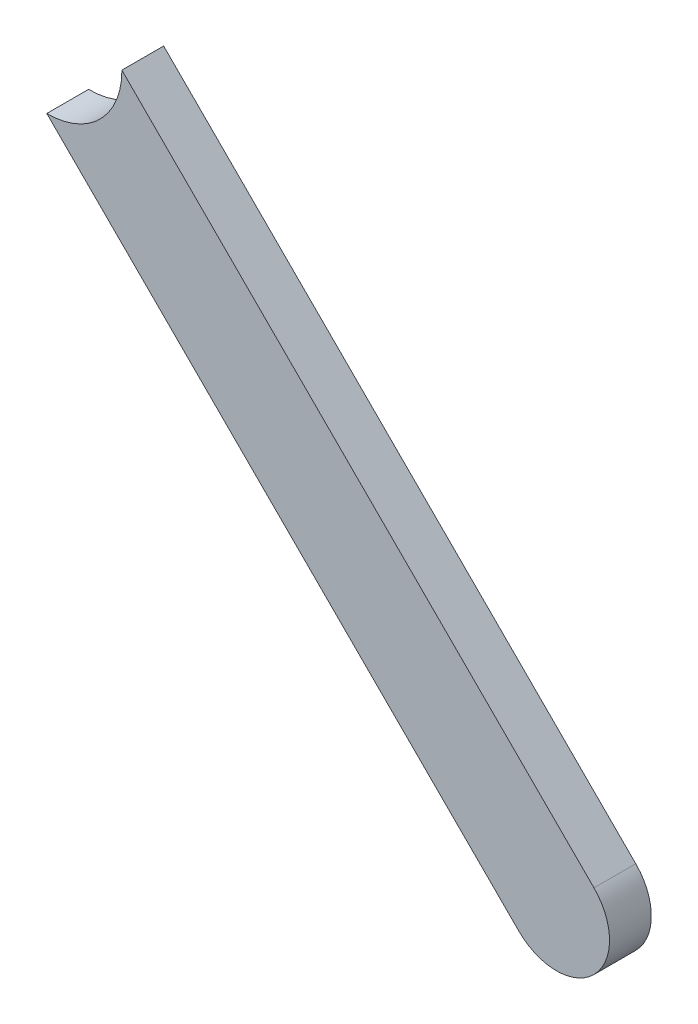
ISO-10303-21;
HEADER;
FILE_DESCRIPTION(('STEP AP214'),'2;1');
FILE_NAME('part.step','',(''),(''),'','','');
FILE_SCHEMA(('AUTOMOTIVE_DESIGN { 1 0 10303 214 1 1 1 1 }'));
ENDSEC;
DATA;
#1=APPLICATION_CONTEXT('core data for automotive mechanical design processes');
#2=APPLICATION_PROTOCOL_DEFINITION('international standard','automotive_design',2000,#1);
#3=PRODUCT_CONTEXT('',#1,'mechanical');
#4=PRODUCT('Part','Part','',(#3));
#5=PRODUCT_RELATED_PRODUCT_CATEGORY('part','',(#4));
#6=PRODUCT_DEFINITION_FORMATION('','',#4);
#7=PRODUCT_DEFINITION_CONTEXT('part definition',#1,'design');
#8=PRODUCT_DEFINITION('design','',#6,#7);
#9=PRODUCT_DEFINITION_SHAPE('','',#8);
#10=(LENGTH_UNIT() NAMED_UNIT(*) SI_UNIT(.MILLI.,.METRE.));
#11=(NAMED_UNIT(*) PLANE_ANGLE_UNIT() SI_UNIT($,.RADIAN.));
#12=(NAMED_UNIT(*) SI_UNIT($,.STERADIAN.) SOLID_ANGLE_UNIT());
#13=UNCERTAINTY_MEASURE_WITH_UNIT(LENGTH_MEASURE(1.E-05),#10,'distance_accuracy_value','');
#14=(GEOMETRIC_REPRESENTATION_CONTEXT(3) GLOBAL_UNCERTAINTY_ASSIGNED_CONTEXT((#13)) GLOBAL_UNIT_ASSIGNED_CONTEXT((#10,
#11,#12)) REPRESENTATION_CONTEXT('',''));
#15=CARTESIAN_POINT('',(0.,0.,0.));
#16=DIRECTION('',(0.,0.,1.));
#17=DIRECTION('',(1.,0.,0.));
#18=AXIS2_PLACEMENT_3D('',#15,#16,#17);
#19=CARTESIAN_POINT('',(124.075372153798,116.103418506202,0.));
#20=DIRECTION('',(0.707106781186547,0.707106781186548,0.));
#21=DIRECTION('',(0.707106781186548,-0.707106781186547,0.));
#22=AXIS2_PLACEMENT_3D('',#19,#20,#21);
#23=PLANE('',#22);
#24=DIRECTION('',(0.707106781186548,-0.707106781186547,0.));
#25=VECTOR('',#24,1.);
#26=CARTESIAN_POINT('',(118.1843966,121.99439406,0.1999996));
#27=LINE('',#26,#25);
#28=CARTESIAN_POINT('',(124.075372153798,116.103418506202,0.1999996));
#29=VERTEX_POINT('',#28);
#30=CARTESIAN_POINT('',(126.3344692,113.84432146,0.1999996));
#31=VERTEX_POINT('',#30);
#32=EDGE_CURVE('E11',#29,#31,#27,.T.);
#33=ORIENTED_EDGE('',*,*,#32,.F.);
#34=DIRECTION('',(0.,0.,1.));
#35=VECTOR('',#34,1.);
#36=CARTESIAN_POINT('',(124.075372153798,116.103418506202,0.));
#37=LINE('',#36,#35);
#38=CARTESIAN_POINT('',(124.075372153798,116.103418506202,0.));
#39=VERTEX_POINT('',#38);
#40=EDGE_CURVE('E24',#39,#29,#37,.T.);
#41=ORIENTED_EDGE('',*,*,#40,.F.);
#42=DIRECTION('',(0.707106781186548,-0.707106781186547,0.));
#43=VECTOR('',#42,1.);
#44=CARTESIAN_POINT('',(118.1843966,121.99439406,0.));
#45=LINE('',#44,#43);
#46=CARTESIAN_POINT('',(126.3344692,113.84432146,0.));
#47=VERTEX_POINT('',#46);
#48=EDGE_CURVE('E82',#39,#47,#45,.T.);
#49=ORIENTED_EDGE('',*,*,#48,.T.);
#50=DIRECTION('',(0.,0.,1.));
#51=VECTOR('',#50,1.);
#52=CARTESIAN_POINT('',(126.3344692,113.84432146,0.));
#53=LINE('',#52,#51);
#54=EDGE_CURVE('E37',#47,#31,#53,.T.);
#55=ORIENTED_EDGE('',*,*,#54,.T.);
#56=EDGE_LOOP('',(#33,#41,#49,#55));
#57=FACE_BOUND('',#56,.T.);
#58=ADVANCED_FACE('F17',(#57),#23,.F.);
#59=CARTESIAN_POINT('',(126.51407514,114.02392613,0.));
#60=DIRECTION('',(0.,0.,-1.));
#61=DIRECTION('',(-0.707109281179556,-0.7071042811847,0.));
#62=AXIS2_PLACEMENT_3D('',#59,#60,#61);
#63=CYLINDRICAL_SURFACE('',#62,0.254000258206741);
#64=CARTESIAN_POINT('',(126.51407514,114.02392613,0.1999996));
#65=DIRECTION('',(0.,0.,1.));
#66=DIRECTION('',(-0.707109281179556,-0.7071042811847,0.));
#67=AXIS2_PLACEMENT_3D('',#64,#65,#66);
#68=CIRCLE('',#67,0.254000258206741);
#69=CARTESIAN_POINT('',(126.69368108,114.2035308,0.1999996));
#70=VERTEX_POINT('',#69);
#71=EDGE_CURVE('E97',#31,#70,#68,.T.);
#72=ORIENTED_EDGE('',*,*,#71,.F.);
#73=ORIENTED_EDGE('',*,*,#54,.F.);
#74=CARTESIAN_POINT('',(126.51407514,114.02392613,0.));
#75=DIRECTION('',(0.,0.,1.));
#76=DIRECTION('',(-0.707109281179556,-0.7071042811847,0.));
#77=AXIS2_PLACEMENT_3D('',#74,#75,#76);
#78=CIRCLE('',#77,0.254000258206741);
#79=CARTESIAN_POINT('',(126.69368108,114.2035308,0.));
#80=VERTEX_POINT('',#79);
#81=EDGE_CURVE('E94',#47,#80,#78,.T.);
#82=ORIENTED_EDGE('',*,*,#81,.T.);
#83=DIRECTION('',(0.,0.,1.));
#84=VECTOR('',#83,1.);
#85=CARTESIAN_POINT('',(126.69368108,114.2035308,0.));
#86=LINE('',#85,#84);
#87=EDGE_CURVE('E92',#80,#70,#86,.T.);
#88=ORIENTED_EDGE('',*,*,#87,.T.);
#89=EDGE_LOOP('',(#72,#73,#82,#88));
#90=FACE_BOUND('',#89,.T.);
#91=ADVANCED_FACE('F103',(#90),#63,.T.);
#92=CARTESIAN_POINT('',(126.69368108,114.2035308,0.));
#93=DIRECTION('',(-0.707106781186548,-0.707106781186548,0.));
#94=DIRECTION('',(-0.707106781186548,0.707106781186548,0.));
#95=AXIS2_PLACEMENT_3D('',#92,#93,#94);
#96=PLANE('',#95);
#97=DIRECTION('',(-0.707106781186548,0.707106781186548,0.));
#98=VECTOR('',#97,1.);
#99=CARTESIAN_POINT('',(126.69368108,114.2035308,0.1999996));
#100=LINE('',#99,#98);
#101=CARTESIAN_POINT('',(124.434581467607,116.462630412393,0.1999996));
#102=VERTEX_POINT('',#101);
#103=EDGE_CURVE('E89',#70,#102,#100,.T.);
#104=ORIENTED_EDGE('',*,*,#103,.F.);
#105=ORIENTED_EDGE('',*,*,#87,.F.);
#106=DIRECTION('',(-0.707106781186548,0.707106781186548,0.));
#107=VECTOR('',#106,1.);
#108=CARTESIAN_POINT('',(126.69368108,114.2035308,0.));
#109=LINE('',#108,#107);
#110=CARTESIAN_POINT('',(124.434581467607,116.462630412393,0.));
#111=VERTEX_POINT('',#110);
#112=EDGE_CURVE('E87',#80,#111,#109,.T.);
#113=ORIENTED_EDGE('',*,*,#112,.T.);
#114=DIRECTION('',(0.,0.,1.));
#115=VECTOR('',#114,1.);
#116=CARTESIAN_POINT('',(124.434581467607,116.462630412393,0.));
#117=LINE('',#116,#115);
#118=EDGE_CURVE('E69',#111,#102,#117,.T.);
#119=ORIENTED_EDGE('',*,*,#118,.T.);
#120=EDGE_LOOP('',(#104,#105,#113,#119));
#121=FACE_BOUND('',#120,.T.);
#122=ADVANCED_FACE('F108',(#121),#96,.F.);
#123=CARTESIAN_POINT('',(124.079,116.459,0.));
#124=DIRECTION('',(0.,0.,-1.));
#125=DIRECTION('',(1.,0.,0.));
#126=AXIS2_PLACEMENT_3D('',#123,#124,#125);
#127=CYLINDRICAL_SURFACE('',#126,0.3556);
#128=DIRECTION('',(0.,0.,1.));
#129=VECTOR('',#128,1.);
#130=CARTESIAN_POINT('',(124.4346,116.459,0.));
#131=LINE('',#130,#129);
#132=CARTESIAN_POINT('',(124.4346,116.459,0.));
#133=VERTEX_POINT('',#132);
#134=CARTESIAN_POINT('',(124.4346,116.459,0.1999996));
#135=VERTEX_POINT('',#134);
#136=EDGE_CURVE('E59',#133,#135,#131,.T.);
#137=ORIENTED_EDGE('',*,*,#136,.T.);
#138=CARTESIAN_POINT('',(124.079,116.459,0.1999996));
#139=DIRECTION('',(0.,0.,1.));
#140=DIRECTION('',(1.,0.,0.));
#141=AXIS2_PLACEMENT_3D('',#138,#139,#140);
#142=CIRCLE('',#141,0.3556);
#143=EDGE_CURVE('E70',#135,#102,#142,.T.);
#144=ORIENTED_EDGE('',*,*,#143,.T.);
#145=ORIENTED_EDGE('',*,*,#118,.F.);
#146=CARTESIAN_POINT('',(124.079,116.459,0.));
#147=DIRECTION('',(0.,0.,1.));
#148=DIRECTION('',(1.,0.,0.));
#149=AXIS2_PLACEMENT_3D('',#146,#147,#148);
#150=CIRCLE('',#149,0.3556);
#151=EDGE_CURVE('E73',#133,#111,#150,.T.);
#152=ORIENTED_EDGE('',*,*,#151,.F.);
#153=EDGE_LOOP('',(#137,#144,#145,#152));
#154=FACE_BOUND('',#153,.T.);
#155=ADVANCED_FACE('F74',(#154),#127,.F.);
#156=CARTESIAN_POINT('',(124.079,116.459,0.));
#157=DIRECTION('',(0.,0.,-1.));
#158=DIRECTION('',(1.,0.,0.));
#159=AXIS2_PLACEMENT_3D('',#156,#157,#158);
#160=CYLINDRICAL_SURFACE('',#159,0.3556);
#161=ORIENTED_EDGE('',*,*,#40,.T.);
#162=CARTESIAN_POINT('',(124.079,116.459,0.1999996));
#163=DIRECTION('',(0.,0.,1.));
#164=DIRECTION('',(1.,0.,0.));
#165=AXIS2_PLACEMENT_3D('',#162,#163,#164);
#166=CIRCLE('',#165,0.3556);
#167=EDGE_CURVE('E65',#29,#135,#166,.T.);
#168=ORIENTED_EDGE('',*,*,#167,.T.);
#169=ORIENTED_EDGE('',*,*,#136,.F.);
#170=EDGE_CURVE('E63',#39,#133,#150,.T.);
#171=ORIENTED_EDGE('',*,*,#170,.F.);
#172=EDGE_LOOP('',(#161,#168,#169,#171));
#173=FACE_BOUND('',#172,.T.);
#174=ADVANCED_FACE('F61',(#173),#160,.F.);
#175=CARTESIAN_POINT('',(118.1843966,121.99439406,0.));
#176=DIRECTION('',(0.,0.,-1.));
#177=DIRECTION('',(-1.,0.,0.));
#178=AXIS2_PLACEMENT_3D('',#175,#176,#177);
#179=PLANE('',#178);
#180=ORIENTED_EDGE('',*,*,#48,.F.);
#181=ORIENTED_EDGE('',*,*,#170,.T.);
#182=ORIENTED_EDGE('',*,*,#151,.T.);
#183=ORIENTED_EDGE('',*,*,#112,.F.);
#184=ORIENTED_EDGE('',*,*,#81,.F.);
#185=EDGE_LOOP('',(#180,#181,#182,#183,#184));
#186=FACE_BOUND('',#185,.T.);
#187=ADVANCED_FACE('F80',(#186),#179,.T.);
#188=CARTESIAN_POINT('',(118.1843966,121.99439406,0.1999996));
#189=DIRECTION('',(0.,0.,-1.));
#190=DIRECTION('',(-1.,0.,0.));
#191=AXIS2_PLACEMENT_3D('',#188,#189,#190);
#192=PLANE('',#191);
#193=ORIENTED_EDGE('',*,*,#167,.F.);
#194=ORIENTED_EDGE('',*,*,#32,.T.);
#195=ORIENTED_EDGE('',*,*,#71,.T.);
#196=ORIENTED_EDGE('',*,*,#103,.T.);
#197=ORIENTED_EDGE('',*,*,#143,.F.);
#198=EDGE_LOOP('',(#193,#194,#195,#196,#197));
#199=FACE_BOUND('',#198,.T.);
#200=ADVANCED_FACE('F106',(#199),#192,.F.);
#201=CLOSED_SHELL('',(#58,#91,#122,#155,#174,#187,#200));
#202=MANIFOLD_SOLID_BREP('B1',#201);
#203=ADVANCED_BREP_SHAPE_REPRESENTATION('',(#18,#202),#14);
#204=SHAPE_DEFINITION_REPRESENTATION(#9,#203);
ENDSEC;
END-ISO-10303-21;
